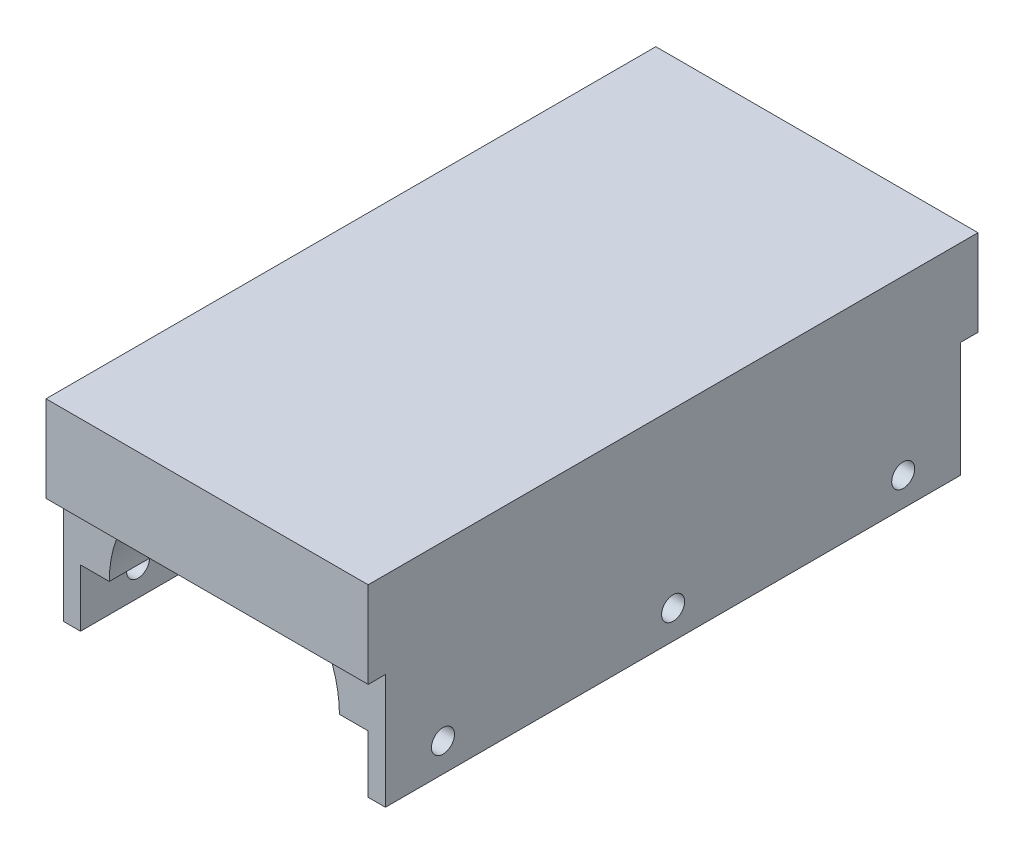
ISO-10303-21;
HEADER;
FILE_DESCRIPTION(('STEP AP214'),'2;1');
FILE_NAME('part.step','',(''),(''),'','','');
FILE_SCHEMA(('AUTOMOTIVE_DESIGN { 1 0 10303 214 1 1 1 1 }'));
ENDSEC;
DATA;
#1=APPLICATION_CONTEXT('core data for automotive mechanical design processes');
#2=APPLICATION_PROTOCOL_DEFINITION('international standard','automotive_design',2000,#1);
#3=PRODUCT_CONTEXT('',#1,'mechanical');
#4=PRODUCT('Part','Part','',(#3));
#5=PRODUCT_RELATED_PRODUCT_CATEGORY('part','',(#4));
#6=PRODUCT_DEFINITION_FORMATION('','',#4);
#7=PRODUCT_DEFINITION_CONTEXT('part definition',#1,'design');
#8=PRODUCT_DEFINITION('design','',#6,#7);
#9=PRODUCT_DEFINITION_SHAPE('','',#8);
#10=(LENGTH_UNIT() NAMED_UNIT(*) SI_UNIT(.MILLI.,.METRE.));
#11=(NAMED_UNIT(*) PLANE_ANGLE_UNIT() SI_UNIT($,.RADIAN.));
#12=(NAMED_UNIT(*) SI_UNIT($,.STERADIAN.) SOLID_ANGLE_UNIT());
#13=UNCERTAINTY_MEASURE_WITH_UNIT(LENGTH_MEASURE(1.E-05),#10,'distance_accuracy_value','');
#14=(GEOMETRIC_REPRESENTATION_CONTEXT(3) GLOBAL_UNCERTAINTY_ASSIGNED_CONTEXT((#13)) GLOBAL_UNIT_ASSIGNED_CONTEXT((#10,
#11,#12)) REPRESENTATION_CONTEXT('',''));
#15=CARTESIAN_POINT('',(0.,0.,0.));
#16=DIRECTION('',(0.,0.,1.));
#17=DIRECTION('',(1.,0.,0.));
#18=AXIS2_PLACEMENT_3D('',#15,#16,#17);
#19=CARTESIAN_POINT('',(0.,0.,-50.));
#20=DIRECTION('',(0.,0.,1.));
#21=DIRECTION('',(1.,0.,0.));
#22=AXIS2_PLACEMENT_3D('',#19,#20,#21);
#23=PLANE('',#22);
#24=DIRECTION('',(0.,-1.,0.));
#25=VECTOR('',#24,1.);
#26=CARTESIAN_POINT('',(-28.,25.,-50.));
#27=LINE('',#26,#25);
#28=CARTESIAN_POINT('',(-28.,9.99999999999999,-50.));
#29=VERTEX_POINT('',#28);
#30=CARTESIAN_POINT('',(-28.,-10.,-50.));
#31=VERTEX_POINT('',#30);
#32=EDGE_CURVE('E233',#29,#31,#27,.T.);
#33=ORIENTED_EDGE('',*,*,#32,.F.);
#34=DIRECTION('',(1.,0.,0.));
#35=VECTOR('',#34,1.);
#36=CARTESIAN_POINT('',(-28.,9.99999999999999,-50.));
#37=LINE('',#36,#35);
#38=CARTESIAN_POINT('',(-17.3205080756888,9.99999999999999,-50.));
#39=VERTEX_POINT('',#38);
#40=EDGE_CURVE('E50',#29,#39,#37,.T.);
#41=ORIENTED_EDGE('',*,*,#40,.T.);
#42=CARTESIAN_POINT('',(0.,0.,-50.));
#43=DIRECTION('',(0.,0.,-1.));
#44=DIRECTION('',(1.,0.,0.));
#45=AXIS2_PLACEMENT_3D('',#42,#43,#44);
#46=CIRCLE('',#45,20.);
#47=CARTESIAN_POINT('',(-20.,0.,-50.));
#48=VERTEX_POINT('',#47);
#49=EDGE_CURVE('E264',#48,#39,#46,.T.);
#50=ORIENTED_EDGE('',*,*,#49,.F.);
#51=DIRECTION('',(1.,0.,0.));
#52=VECTOR('',#51,1.);
#53=CARTESIAN_POINT('',(-25.,0.,-50.));
#54=LINE('',#53,#52);
#55=CARTESIAN_POINT('',(-25.,0.,-50.));
#56=VERTEX_POINT('',#55);
#57=EDGE_CURVE('E261',#56,#48,#54,.T.);
#58=ORIENTED_EDGE('',*,*,#57,.F.);
#59=DIRECTION('',(0.,1.,0.));
#60=VECTOR('',#59,1.);
#61=CARTESIAN_POINT('',(-25.,-10.,-50.));
#62=LINE('',#61,#60);
#63=CARTESIAN_POINT('',(-25.,-10.,-50.));
#64=VERTEX_POINT('',#63);
#65=EDGE_CURVE('E259',#64,#56,#62,.T.);
#66=ORIENTED_EDGE('',*,*,#65,.F.);
#67=DIRECTION('',(1.,0.,0.));
#68=VECTOR('',#67,1.);
#69=CARTESIAN_POINT('',(-28.,-10.,-50.));
#70=LINE('',#69,#68);
#71=EDGE_CURVE('E257',#31,#64,#70,.T.);
#72=ORIENTED_EDGE('',*,*,#71,.F.);
#73=EDGE_LOOP('',(#33,#41,#50,#58,#66,#72));
#74=FACE_BOUND('',#73,.T.);
#75=ADVANCED_FACE('F39',(#74),#23,.F.);
#76=CARTESIAN_POINT('',(0.,0.,50.));
#77=DIRECTION('',(0.,0.,1.));
#78=DIRECTION('',(1.,0.,0.));
#79=AXIS2_PLACEMENT_3D('',#76,#77,#78);
#80=PLANE('',#79);
#81=DIRECTION('',(1.,0.,0.));
#82=VECTOR('',#81,1.);
#83=CARTESIAN_POINT('',(-28.,9.99999999999999,50.));
#84=LINE('',#83,#82);
#85=CARTESIAN_POINT('',(-28.,9.99999999999999,50.));
#86=VERTEX_POINT('',#85);
#87=CARTESIAN_POINT('',(-17.3205080756888,9.99999999999999,50.));
#88=VERTEX_POINT('',#87);
#89=EDGE_CURVE('E189',#86,#88,#84,.T.);
#90=ORIENTED_EDGE('',*,*,#89,.F.);
#91=DIRECTION('',(0.,-1.,0.));
#92=VECTOR('',#91,1.);
#93=CARTESIAN_POINT('',(-28.,25.,50.));
#94=LINE('',#93,#92);
#95=CARTESIAN_POINT('',(-28.,-10.,50.));
#96=VERTEX_POINT('',#95);
#97=EDGE_CURVE('E234',#86,#96,#94,.T.);
#98=ORIENTED_EDGE('',*,*,#97,.T.);
#99=DIRECTION('',(1.,0.,0.));
#100=VECTOR('',#99,1.);
#101=CARTESIAN_POINT('',(-28.,-10.,50.));
#102=LINE('',#101,#100);
#103=CARTESIAN_POINT('',(-25.,-10.,50.));
#104=VERTEX_POINT('',#103);
#105=EDGE_CURVE('E236',#96,#104,#102,.T.);
#106=ORIENTED_EDGE('',*,*,#105,.T.);
#107=DIRECTION('',(0.,1.,0.));
#108=VECTOR('',#107,1.);
#109=CARTESIAN_POINT('',(-25.,-10.,50.));
#110=LINE('',#109,#108);
#111=CARTESIAN_POINT('',(-25.,0.,50.));
#112=VERTEX_POINT('',#111);
#113=EDGE_CURVE('E239',#104,#112,#110,.T.);
#114=ORIENTED_EDGE('',*,*,#113,.T.);
#115=DIRECTION('',(1.,0.,0.));
#116=VECTOR('',#115,1.);
#117=CARTESIAN_POINT('',(-25.,0.,50.));
#118=LINE('',#117,#116);
#119=CARTESIAN_POINT('',(-20.,0.,50.));
#120=VERTEX_POINT('',#119);
#121=EDGE_CURVE('E241',#112,#120,#118,.T.);
#122=ORIENTED_EDGE('',*,*,#121,.T.);
#123=CARTESIAN_POINT('',(0.,0.,50.));
#124=DIRECTION('',(0.,0.,-1.));
#125=DIRECTION('',(1.,0.,0.));
#126=AXIS2_PLACEMENT_3D('',#123,#124,#125);
#127=CIRCLE('',#126,20.);
#128=EDGE_CURVE('E244',#120,#88,#127,.T.);
#129=ORIENTED_EDGE('',*,*,#128,.T.);
#130=EDGE_LOOP('',(#90,#98,#106,#114,#122,#129));
#131=FACE_BOUND('',#130,.T.);
#132=ADVANCED_FACE('F377',(#131),#80,.T.);
#133=CARTESIAN_POINT('',(-28.,25.,50.));
#134=DIRECTION('',(0.,-1.,0.));
#135=DIRECTION('',(0.,0.,-1.));
#136=AXIS2_PLACEMENT_3D('',#133,#134,#135);
#137=PLANE('',#136);
#138=DIRECTION('',(0.,0.,-1.));
#139=VECTOR('',#138,1.);
#140=CARTESIAN_POINT('',(28.,25.,50.));
#141=LINE('',#140,#139);
#142=CARTESIAN_POINT('',(28.,25.,53.));
#143=VERTEX_POINT('',#142);
#144=CARTESIAN_POINT('',(28.,25.,-53.));
#145=VERTEX_POINT('',#144);
#146=EDGE_CURVE('E176',#143,#145,#141,.T.);
#147=ORIENTED_EDGE('',*,*,#146,.T.);
#148=DIRECTION('',(-1.,0.,0.));
#149=VECTOR('',#148,1.);
#150=CARTESIAN_POINT('',(-28.,25.,-53.));
#151=LINE('',#150,#149);
#152=CARTESIAN_POINT('',(-28.,25.,-53.));
#153=VERTEX_POINT('',#152);
#154=EDGE_CURVE('E172',#145,#153,#151,.T.);
#155=ORIENTED_EDGE('',*,*,#154,.T.);
#156=DIRECTION('',(0.,0.,-1.));
#157=VECTOR('',#156,1.);
#158=CARTESIAN_POINT('',(-28.,25.,50.));
#159=LINE('',#158,#157);
#160=CARTESIAN_POINT('',(-28.,25.,53.));
#161=VERTEX_POINT('',#160);
#162=EDGE_CURVE('E154',#161,#153,#159,.T.);
#163=ORIENTED_EDGE('',*,*,#162,.F.);
#164=DIRECTION('',(-1.,0.,0.));
#165=VECTOR('',#164,1.);
#166=CARTESIAN_POINT('',(-28.,25.,53.));
#167=LINE('',#166,#165);
#168=EDGE_CURVE('E194',#143,#161,#167,.T.);
#169=ORIENTED_EDGE('',*,*,#168,.F.);
#170=EDGE_LOOP('',(#147,#155,#163,#169));
#171=FACE_BOUND('',#170,.T.);
#172=ADVANCED_FACE('F41',(#171),#137,.F.);
#173=CARTESIAN_POINT('',(-28.,25.,50.));
#174=DIRECTION('',(1.,0.,0.));
#175=DIRECTION('',(0.,1.,0.));
#176=AXIS2_PLACEMENT_3D('',#173,#174,#175);
#177=PLANE('',#176);
#178=CARTESIAN_POINT('',(-28.,-5.,40.));
#179=DIRECTION('',(1.,0.,0.));
#180=DIRECTION('',(0.,1.,0.));
#181=AXIS2_PLACEMENT_3D('',#178,#179,#180);
#182=CIRCLE('',#181,2.);
#183=CARTESIAN_POINT('',(-28.,-3.,40.));
#184=VERTEX_POINT('',#183);
#185=EDGE_CURVE('E230',#184,#184,#182,.T.);
#186=ORIENTED_EDGE('',*,*,#185,.T.);
#187=EDGE_LOOP('',(#186));
#188=FACE_BOUND('',#187,.T.);
#189=CARTESIAN_POINT('',(-28.,-5.,0.));
#190=DIRECTION('',(1.,0.,0.));
#191=DIRECTION('',(0.,1.,0.));
#192=AXIS2_PLACEMENT_3D('',#189,#190,#191);
#193=CIRCLE('',#192,2.);
#194=CARTESIAN_POINT('',(-28.,-3.,0.));
#195=VERTEX_POINT('',#194);
#196=EDGE_CURVE('E221',#195,#195,#193,.T.);
#197=ORIENTED_EDGE('',*,*,#196,.T.);
#198=EDGE_LOOP('',(#197));
#199=FACE_BOUND('',#198,.T.);
#200=CARTESIAN_POINT('',(-28.,-5.,-40.));
#201=DIRECTION('',(1.,0.,0.));
#202=DIRECTION('',(0.,1.,0.));
#203=AXIS2_PLACEMENT_3D('',#200,#201,#202);
#204=CIRCLE('',#203,2.);
#205=CARTESIAN_POINT('',(-28.,-3.,-40.));
#206=VERTEX_POINT('',#205);
#207=EDGE_CURVE('E211',#206,#206,#204,.T.);
#208=ORIENTED_EDGE('',*,*,#207,.T.);
#209=EDGE_LOOP('',(#208));
#210=FACE_BOUND('',#209,.T.);
#211=ORIENTED_EDGE('',*,*,#162,.T.);
#212=DIRECTION('',(0.,-1.,0.));
#213=VECTOR('',#212,1.);
#214=CARTESIAN_POINT('',(-28.,25.,-53.));
#215=LINE('',#214,#213);
#216=CARTESIAN_POINT('',(-28.,9.99999999999999,-53.));
#217=VERTEX_POINT('',#216);
#218=EDGE_CURVE('E157',#153,#217,#215,.T.);
#219=ORIENTED_EDGE('',*,*,#218,.T.);
#220=DIRECTION('',(0.,0.,1.));
#221=VECTOR('',#220,1.);
#222=CARTESIAN_POINT('',(-28.,9.99999999999999,-53.));
#223=LINE('',#222,#221);
#224=EDGE_CURVE('E181',#217,#29,#223,.T.);
#225=ORIENTED_EDGE('',*,*,#224,.T.);
#226=ORIENTED_EDGE('',*,*,#32,.T.);
#227=DIRECTION('',(0.,0.,-1.));
#228=VECTOR('',#227,1.);
#229=CARTESIAN_POINT('',(-28.,-10.,50.));
#230=LINE('',#229,#228);
#231=EDGE_CURVE('E166',#96,#31,#230,.T.);
#232=ORIENTED_EDGE('',*,*,#231,.F.);
#233=ORIENTED_EDGE('',*,*,#97,.F.);
#234=DIRECTION('',(0.,0.,-1.));
#235=VECTOR('',#234,1.);
#236=CARTESIAN_POINT('',(-28.,9.99999999999999,53.));
#237=LINE('',#236,#235);
#238=CARTESIAN_POINT('',(-28.,9.99999999999999,53.));
#239=VERTEX_POINT('',#238);
#240=EDGE_CURVE('E201',#239,#86,#237,.T.);
#241=ORIENTED_EDGE('',*,*,#240,.F.);
#242=DIRECTION('',(0.,-1.,0.));
#243=VECTOR('',#242,1.);
#244=CARTESIAN_POINT('',(-28.,25.,53.));
#245=LINE('',#244,#243);
#246=EDGE_CURVE('E161',#161,#239,#245,.T.);
#247=ORIENTED_EDGE('',*,*,#246,.F.);
#248=EDGE_LOOP('',(#211,#219,#225,#226,#232,#233,#241,#247));
#249=FACE_BOUND('',#248,.T.);
#250=ADVANCED_FACE('F156',(#188,#199,#210,#249),#177,.F.);
#251=CARTESIAN_POINT('',(-28.,-10.,50.));
#252=DIRECTION('',(0.,1.,0.));
#253=DIRECTION('',(0.,0.,1.));
#254=AXIS2_PLACEMENT_3D('',#251,#252,#253);
#255=PLANE('',#254);
#256=ORIENTED_EDGE('',*,*,#71,.T.);
#257=DIRECTION('',(0.,0.,-1.));
#258=VECTOR('',#257,1.);
#259=CARTESIAN_POINT('',(-25.,-10.,50.));
#260=LINE('',#259,#258);
#261=EDGE_CURVE('E295',#104,#64,#260,.T.);
#262=ORIENTED_EDGE('',*,*,#261,.F.);
#263=ORIENTED_EDGE('',*,*,#105,.F.);
#264=ORIENTED_EDGE('',*,*,#231,.T.);
#265=EDGE_LOOP('',(#256,#262,#263,#264));
#266=FACE_BOUND('',#265,.T.);
#267=ADVANCED_FACE('F373',(#266),#255,.F.);
#268=CARTESIAN_POINT('',(-25.,-10.,50.));
#269=DIRECTION('',(-1.,0.,0.));
#270=DIRECTION('',(0.,0.,1.));
#271=AXIS2_PLACEMENT_3D('',#268,#269,#270);
#272=PLANE('',#271);
#273=CARTESIAN_POINT('',(-25.,-5.,40.));
#274=DIRECTION('',(-1.,0.,0.));
#275=DIRECTION('',(0.,0.,1.));
#276=AXIS2_PLACEMENT_3D('',#273,#274,#275);
#277=CIRCLE('',#276,2.);
#278=CARTESIAN_POINT('',(-25.,-5.,42.));
#279=VERTEX_POINT('',#278);
#280=EDGE_CURVE('E227',#279,#279,#277,.T.);
#281=ORIENTED_EDGE('',*,*,#280,.T.);
#282=EDGE_LOOP('',(#281));
#283=FACE_BOUND('',#282,.T.);
#284=CARTESIAN_POINT('',(-25.,-5.,0.));
#285=DIRECTION('',(-1.,0.,0.));
#286=DIRECTION('',(0.,0.,1.));
#287=AXIS2_PLACEMENT_3D('',#284,#285,#286);
#288=CIRCLE('',#287,2.);
#289=CARTESIAN_POINT('',(-25.,-5.,2.));
#290=VERTEX_POINT('',#289);
#291=EDGE_CURVE('E218',#290,#290,#288,.T.);
#292=ORIENTED_EDGE('',*,*,#291,.T.);
#293=EDGE_LOOP('',(#292));
#294=FACE_BOUND('',#293,.T.);
#295=CARTESIAN_POINT('',(-25.,-5.,-40.));
#296=DIRECTION('',(-1.,0.,0.));
#297=DIRECTION('',(0.,0.,1.));
#298=AXIS2_PLACEMENT_3D('',#295,#296,#297);
#299=CIRCLE('',#298,2.);
#300=CARTESIAN_POINT('',(-25.,-5.,-38.));
#301=VERTEX_POINT('',#300);
#302=EDGE_CURVE('E208',#301,#301,#299,.T.);
#303=ORIENTED_EDGE('',*,*,#302,.T.);
#304=EDGE_LOOP('',(#303));
#305=FACE_BOUND('',#304,.T.);
#306=ORIENTED_EDGE('',*,*,#65,.T.);
#307=DIRECTION('',(0.,0.,-1.));
#308=VECTOR('',#307,1.);
#309=CARTESIAN_POINT('',(-25.,0.,50.));
#310=LINE('',#309,#308);
#311=EDGE_CURVE('E292',#112,#56,#310,.T.);
#312=ORIENTED_EDGE('',*,*,#311,.F.);
#313=ORIENTED_EDGE('',*,*,#113,.F.);
#314=ORIENTED_EDGE('',*,*,#261,.T.);
#315=EDGE_LOOP('',(#306,#312,#313,#314));
#316=FACE_BOUND('',#315,.T.);
#317=ADVANCED_FACE('F585',(#283,#294,#305,#316),#272,.F.);
#318=CARTESIAN_POINT('',(-25.,0.,50.));
#319=DIRECTION('',(0.,1.,0.));
#320=DIRECTION('',(-1.,0.,0.));
#321=AXIS2_PLACEMENT_3D('',#318,#319,#320);
#322=PLANE('',#321);
#323=ORIENTED_EDGE('',*,*,#57,.T.);
#324=DIRECTION('',(0.,0.,-1.));
#325=VECTOR('',#324,1.);
#326=CARTESIAN_POINT('',(-20.,0.,50.));
#327=LINE('',#326,#325);
#328=EDGE_CURVE('E289',#120,#48,#327,.T.);
#329=ORIENTED_EDGE('',*,*,#328,.F.);
#330=ORIENTED_EDGE('',*,*,#121,.F.);
#331=ORIENTED_EDGE('',*,*,#311,.T.);
#332=EDGE_LOOP('',(#323,#329,#330,#331));
#333=FACE_BOUND('',#332,.T.);
#334=ADVANCED_FACE('F490',(#333),#322,.F.);
#335=CARTESIAN_POINT('',(0.,0.,50.));
#336=DIRECTION('',(0.,0.,-1.));
#337=DIRECTION('',(-1.,0.,0.));
#338=AXIS2_PLACEMENT_3D('',#335,#336,#337);
#339=CYLINDRICAL_SURFACE('',#338,20.);
#340=ORIENTED_EDGE('',*,*,#49,.T.);
#341=CARTESIAN_POINT('',(17.3205080756888,10.,-50.));
#342=VERTEX_POINT('',#341);
#343=EDGE_CURVE('E268',#39,#342,#46,.T.);
#344=ORIENTED_EDGE('',*,*,#343,.T.);
#345=CARTESIAN_POINT('',(20.,0.,-50.));
#346=VERTEX_POINT('',#345);
#347=EDGE_CURVE('E263',#342,#346,#46,.T.);
#348=ORIENTED_EDGE('',*,*,#347,.T.);
#349=DIRECTION('',(0.,0.,-1.));
#350=VECTOR('',#349,1.);
#351=CARTESIAN_POINT('',(20.,0.,50.));
#352=LINE('',#351,#350);
#353=CARTESIAN_POINT('',(20.,0.,50.));
#354=VERTEX_POINT('',#353);
#355=EDGE_CURVE('E286',#354,#346,#352,.T.);
#356=ORIENTED_EDGE('',*,*,#355,.F.);
#357=CARTESIAN_POINT('',(17.3205080756888,9.99999999999999,50.));
#358=VERTEX_POINT('',#357);
#359=EDGE_CURVE('E243',#358,#354,#127,.T.);
#360=ORIENTED_EDGE('',*,*,#359,.F.);
#361=EDGE_CURVE('E248',#88,#358,#127,.T.);
#362=ORIENTED_EDGE('',*,*,#361,.F.);
#363=ORIENTED_EDGE('',*,*,#128,.F.);
#364=ORIENTED_EDGE('',*,*,#328,.T.);
#365=EDGE_LOOP('',(#340,#344,#348,#356,#360,#362,#363,#364));
#366=FACE_BOUND('',#365,.T.);
#367=ADVANCED_FACE('F354',(#366),#339,.F.);
#368=CARTESIAN_POINT('',(20.,0.,50.));
#369=DIRECTION('',(0.,1.,0.));
#370=DIRECTION('',(-1.,0.,0.));
#371=AXIS2_PLACEMENT_3D('',#368,#369,#370);
#372=PLANE('',#371);
#373=DIRECTION('',(1.,0.,0.));
#374=VECTOR('',#373,1.);
#375=CARTESIAN_POINT('',(20.,0.,-50.));
#376=LINE('',#375,#374);
#377=CARTESIAN_POINT('',(25.,0.,-50.));
#378=VERTEX_POINT('',#377);
#379=EDGE_CURVE('E267',#346,#378,#376,.T.);
#380=ORIENTED_EDGE('',*,*,#379,.T.);
#381=DIRECTION('',(0.,0.,-1.));
#382=VECTOR('',#381,1.);
#383=CARTESIAN_POINT('',(25.,0.,50.));
#384=LINE('',#383,#382);
#385=CARTESIAN_POINT('',(25.,0.,50.));
#386=VERTEX_POINT('',#385);
#387=EDGE_CURVE('E283',#386,#378,#384,.T.);
#388=ORIENTED_EDGE('',*,*,#387,.F.);
#389=DIRECTION('',(1.,0.,0.));
#390=VECTOR('',#389,1.);
#391=CARTESIAN_POINT('',(20.,0.,50.));
#392=LINE('',#391,#390);
#393=EDGE_CURVE('E247',#354,#386,#392,.T.);
#394=ORIENTED_EDGE('',*,*,#393,.F.);
#395=ORIENTED_EDGE('',*,*,#355,.T.);
#396=EDGE_LOOP('',(#380,#388,#394,#395));
#397=FACE_BOUND('',#396,.T.);
#398=ADVANCED_FACE('F320',(#397),#372,.F.);
#399=CARTESIAN_POINT('',(25.,0.,50.));
#400=DIRECTION('',(1.,0.,0.));
#401=DIRECTION('',(0.,0.,-1.));
#402=AXIS2_PLACEMENT_3D('',#399,#400,#401);
#403=PLANE('',#402);
#404=CARTESIAN_POINT('',(25.,-5.,40.));
#405=DIRECTION('',(1.,0.,0.));
#406=DIRECTION('',(0.,0.,-1.));
#407=AXIS2_PLACEMENT_3D('',#404,#405,#406);
#408=CIRCLE('',#407,2.);
#409=CARTESIAN_POINT('',(25.,-5.,38.));
#410=VERTEX_POINT('',#409);
#411=EDGE_CURVE('E224',#410,#410,#408,.T.);
#412=ORIENTED_EDGE('',*,*,#411,.T.);
#413=EDGE_LOOP('',(#412));
#414=FACE_BOUND('',#413,.T.);
#415=CARTESIAN_POINT('',(25.,-5.,0.));
#416=DIRECTION('',(1.,0.,0.));
#417=DIRECTION('',(0.,0.,-1.));
#418=AXIS2_PLACEMENT_3D('',#415,#416,#417);
#419=CIRCLE('',#418,2.);
#420=CARTESIAN_POINT('',(25.,-5.,-2.));
#421=VERTEX_POINT('',#420);
#422=EDGE_CURVE('E215',#421,#421,#419,.T.);
#423=ORIENTED_EDGE('',*,*,#422,.T.);
#424=EDGE_LOOP('',(#423));
#425=FACE_BOUND('',#424,.T.);
#426=CARTESIAN_POINT('',(25.,-5.,-40.));
#427=DIRECTION('',(1.,0.,0.));
#428=DIRECTION('',(0.,0.,-1.));
#429=AXIS2_PLACEMENT_3D('',#426,#427,#428);
#430=CIRCLE('',#429,2.);
#431=CARTESIAN_POINT('',(25.,-5.,-42.));
#432=VERTEX_POINT('',#431);
#433=EDGE_CURVE('E205',#432,#432,#430,.T.);
#434=ORIENTED_EDGE('',*,*,#433,.T.);
#435=EDGE_LOOP('',(#434));
#436=FACE_BOUND('',#435,.T.);
#437=DIRECTION('',(0.,-1.,0.));
#438=VECTOR('',#437,1.);
#439=CARTESIAN_POINT('',(25.,0.,-50.));
#440=LINE('',#439,#438);
#441=CARTESIAN_POINT('',(25.,-10.,-50.));
#442=VERTEX_POINT('',#441);
#443=EDGE_CURVE('E270',#378,#442,#440,.T.);
#444=ORIENTED_EDGE('',*,*,#443,.T.);
#445=DIRECTION('',(0.,0.,-1.));
#446=VECTOR('',#445,1.);
#447=CARTESIAN_POINT('',(25.,-10.,50.));
#448=LINE('',#447,#446);
#449=CARTESIAN_POINT('',(25.,-10.,50.));
#450=VERTEX_POINT('',#449);
#451=EDGE_CURVE('E280',#450,#442,#448,.T.);
#452=ORIENTED_EDGE('',*,*,#451,.F.);
#453=DIRECTION('',(0.,-1.,0.));
#454=VECTOR('',#453,1.);
#455=CARTESIAN_POINT('',(25.,0.,50.));
#456=LINE('',#455,#454);
#457=EDGE_CURVE('E250',#386,#450,#456,.T.);
#458=ORIENTED_EDGE('',*,*,#457,.F.);
#459=ORIENTED_EDGE('',*,*,#387,.T.);
#460=EDGE_LOOP('',(#444,#452,#458,#459));
#461=FACE_BOUND('',#460,.T.);
#462=ADVANCED_FACE('F316',(#414,#425,#436,#461),#403,.F.);
#463=CARTESIAN_POINT('',(25.,-10.,50.));
#464=DIRECTION('',(0.,1.,0.));
#465=DIRECTION('',(0.,0.,1.));
#466=AXIS2_PLACEMENT_3D('',#463,#464,#465);
#467=PLANE('',#466);
#468=DIRECTION('',(1.,0.,0.));
#469=VECTOR('',#468,1.);
#470=CARTESIAN_POINT('',(25.,-10.,-50.));
#471=LINE('',#470,#469);
#472=CARTESIAN_POINT('',(28.,-10.,-50.));
#473=VERTEX_POINT('',#472);
#474=EDGE_CURVE('E272',#442,#473,#471,.T.);
#475=ORIENTED_EDGE('',*,*,#474,.T.);
#476=DIRECTION('',(0.,0.,-1.));
#477=VECTOR('',#476,1.);
#478=CARTESIAN_POINT('',(28.,-10.,50.));
#479=LINE('',#478,#477);
#480=CARTESIAN_POINT('',(28.,-10.,50.));
#481=VERTEX_POINT('',#480);
#482=EDGE_CURVE('E277',#481,#473,#479,.T.);
#483=ORIENTED_EDGE('',*,*,#482,.F.);
#484=DIRECTION('',(1.,0.,0.));
#485=VECTOR('',#484,1.);
#486=CARTESIAN_POINT('',(25.,-10.,50.));
#487=LINE('',#486,#485);
#488=EDGE_CURVE('E252',#450,#481,#487,.T.);
#489=ORIENTED_EDGE('',*,*,#488,.F.);
#490=ORIENTED_EDGE('',*,*,#451,.T.);
#491=EDGE_LOOP('',(#475,#483,#489,#490));
#492=FACE_BOUND('',#491,.T.);
#493=ADVANCED_FACE('F319',(#492),#467,.F.);
#494=CARTESIAN_POINT('',(28.,-10.,50.));
#495=DIRECTION('',(-1.,0.,0.));
#496=DIRECTION('',(0.,-1.,0.));
#497=AXIS2_PLACEMENT_3D('',#494,#495,#496);
#498=PLANE('',#497);
#499=CARTESIAN_POINT('',(28.,-5.,40.));
#500=DIRECTION('',(-1.,0.,0.));
#501=DIRECTION('',(0.,-1.,0.));
#502=AXIS2_PLACEMENT_3D('',#499,#500,#501);
#503=CIRCLE('',#502,2.);
#504=CARTESIAN_POINT('',(28.,-6.99999999999999,40.));
#505=VERTEX_POINT('',#504);
#506=EDGE_CURVE('E43',#505,#505,#503,.T.);
#507=ORIENTED_EDGE('',*,*,#506,.T.);
#508=EDGE_LOOP('',(#507));
#509=FACE_BOUND('',#508,.T.);
#510=CARTESIAN_POINT('',(28.,-5.,0.));
#511=DIRECTION('',(-1.,0.,0.));
#512=DIRECTION('',(0.,-1.,0.));
#513=AXIS2_PLACEMENT_3D('',#510,#511,#512);
#514=CIRCLE('',#513,2.);
#515=CARTESIAN_POINT('',(28.,-7.,0.));
#516=VERTEX_POINT('',#515);
#517=EDGE_CURVE('E214',#516,#516,#514,.T.);
#518=ORIENTED_EDGE('',*,*,#517,.T.);
#519=EDGE_LOOP('',(#518));
#520=FACE_BOUND('',#519,.T.);
#521=CARTESIAN_POINT('',(28.,-5.,-40.));
#522=DIRECTION('',(-1.,0.,0.));
#523=DIRECTION('',(0.,-1.,0.));
#524=AXIS2_PLACEMENT_3D('',#521,#522,#523);
#525=CIRCLE('',#524,2.);
#526=CARTESIAN_POINT('',(28.,-7.,-40.));
#527=VERTEX_POINT('',#526);
#528=EDGE_CURVE('E204',#527,#527,#525,.T.);
#529=ORIENTED_EDGE('',*,*,#528,.T.);
#530=EDGE_LOOP('',(#529));
#531=FACE_BOUND('',#530,.T.);
#532=DIRECTION('',(0.,1.,0.));
#533=VECTOR('',#532,1.);
#534=CARTESIAN_POINT('',(28.,-10.,-50.));
#535=LINE('',#534,#533);
#536=CARTESIAN_POINT('',(28.,10.,-50.));
#537=VERTEX_POINT('',#536);
#538=EDGE_CURVE('E237',#473,#537,#535,.T.);
#539=ORIENTED_EDGE('',*,*,#538,.T.);
#540=DIRECTION('',(0.,0.,1.));
#541=VECTOR('',#540,1.);
#542=CARTESIAN_POINT('',(28.,10.,-53.));
#543=LINE('',#542,#541);
#544=CARTESIAN_POINT('',(28.,10.,-53.));
#545=VERTEX_POINT('',#544);
#546=EDGE_CURVE('E58',#545,#537,#543,.T.);
#547=ORIENTED_EDGE('',*,*,#546,.F.);
#548=DIRECTION('',(0.,1.,0.));
#549=VECTOR('',#548,1.);
#550=CARTESIAN_POINT('',(28.,25.,-53.));
#551=LINE('',#550,#549);
#552=EDGE_CURVE('E177',#545,#145,#551,.T.);
#553=ORIENTED_EDGE('',*,*,#552,.T.);
#554=ORIENTED_EDGE('',*,*,#146,.F.);
#555=DIRECTION('',(0.,1.,0.));
#556=VECTOR('',#555,1.);
#557=CARTESIAN_POINT('',(28.,25.,53.));
#558=LINE('',#557,#556);
#559=CARTESIAN_POINT('',(28.,10.,53.));
#560=VERTEX_POINT('',#559);
#561=EDGE_CURVE('E191',#560,#143,#558,.T.);
#562=ORIENTED_EDGE('',*,*,#561,.F.);
#563=DIRECTION('',(0.,0.,-1.));
#564=VECTOR('',#563,1.);
#565=CARTESIAN_POINT('',(28.,10.,53.));
#566=LINE('',#565,#564);
#567=CARTESIAN_POINT('',(28.,10.,50.));
#568=VERTEX_POINT('',#567);
#569=EDGE_CURVE('E196',#560,#568,#566,.T.);
#570=ORIENTED_EDGE('',*,*,#569,.T.);
#571=DIRECTION('',(0.,1.,0.));
#572=VECTOR('',#571,1.);
#573=CARTESIAN_POINT('',(28.,-10.,50.));
#574=LINE('',#573,#572);
#575=EDGE_CURVE('E254',#481,#568,#574,.T.);
#576=ORIENTED_EDGE('',*,*,#575,.F.);
#577=ORIENTED_EDGE('',*,*,#482,.T.);
#578=EDGE_LOOP('',(#539,#547,#553,#554,#562,#570,#576,#577));
#579=FACE_BOUND('',#578,.T.);
#580=ADVANCED_FACE('F304',(#509,#520,#531,#579),#498,.F.);
#581=EDGE_CURVE('E48',#358,#568,#84,.T.);
#582=ORIENTED_EDGE('',*,*,#581,.F.);
#583=ORIENTED_EDGE('',*,*,#359,.T.);
#584=ORIENTED_EDGE('',*,*,#393,.T.);
#585=ORIENTED_EDGE('',*,*,#457,.T.);
#586=ORIENTED_EDGE('',*,*,#488,.T.);
#587=ORIENTED_EDGE('',*,*,#575,.T.);
#588=EDGE_LOOP('',(#582,#583,#584,#585,#586,#587));
#589=FACE_BOUND('',#588,.T.);
#590=ADVANCED_FACE('F342',(#589),#80,.T.);
#591=ORIENTED_EDGE('',*,*,#347,.F.);
#592=EDGE_CURVE('E11',#342,#537,#37,.T.);
#593=ORIENTED_EDGE('',*,*,#592,.T.);
#594=ORIENTED_EDGE('',*,*,#538,.F.);
#595=ORIENTED_EDGE('',*,*,#474,.F.);
#596=ORIENTED_EDGE('',*,*,#443,.F.);
#597=ORIENTED_EDGE('',*,*,#379,.F.);
#598=EDGE_LOOP('',(#591,#593,#594,#595,#596,#597));
#599=FACE_BOUND('',#598,.T.);
#600=ADVANCED_FACE('F337',(#599),#23,.F.);
#601=CARTESIAN_POINT('',(-125.,-5.,-40.));
#602=DIRECTION('',(1.,0.,0.));
#603=DIRECTION('',(0.,0.,-1.));
#604=AXIS2_PLACEMENT_3D('',#601,#602,#603);
#605=CYLINDRICAL_SURFACE('',#604,2.);
#606=ORIENTED_EDGE('',*,*,#528,.F.);
#607=EDGE_LOOP('',(#606));
#608=FACE_BOUND('',#607,.T.);
#609=ORIENTED_EDGE('',*,*,#433,.F.);
#610=EDGE_LOOP('',(#609));
#611=FACE_BOUND('',#610,.T.);
#612=ADVANCED_FACE('F311',(#608,#611),#605,.F.);
#613=CARTESIAN_POINT('',(-125.,-5.,0.));
#614=DIRECTION('',(1.,0.,0.));
#615=DIRECTION('',(0.,0.,-1.));
#616=AXIS2_PLACEMENT_3D('',#613,#614,#615);
#617=CYLINDRICAL_SURFACE('',#616,2.);
#618=ORIENTED_EDGE('',*,*,#517,.F.);
#619=EDGE_LOOP('',(#618));
#620=FACE_BOUND('',#619,.T.);
#621=ORIENTED_EDGE('',*,*,#422,.F.);
#622=EDGE_LOOP('',(#621));
#623=FACE_BOUND('',#622,.T.);
#624=ADVANCED_FACE('F307',(#620,#623),#617,.F.);
#625=CARTESIAN_POINT('',(-125.,-5.,40.));
#626=DIRECTION('',(1.,0.,0.));
#627=DIRECTION('',(0.,0.,-1.));
#628=AXIS2_PLACEMENT_3D('',#625,#626,#627);
#629=CYLINDRICAL_SURFACE('',#628,2.);
#630=ORIENTED_EDGE('',*,*,#506,.F.);
#631=EDGE_LOOP('',(#630));
#632=FACE_BOUND('',#631,.T.);
#633=ORIENTED_EDGE('',*,*,#411,.F.);
#634=EDGE_LOOP('',(#633));
#635=FACE_BOUND('',#634,.T.);
#636=ADVANCED_FACE('F310',(#632,#635),#629,.F.);
#637=ORIENTED_EDGE('',*,*,#302,.F.);
#638=EDGE_LOOP('',(#637));
#639=FACE_BOUND('',#638,.T.);
#640=ORIENTED_EDGE('',*,*,#207,.F.);
#641=EDGE_LOOP('',(#640));
#642=FACE_BOUND('',#641,.T.);
#643=ADVANCED_FACE('F405',(#639,#642),#605,.F.);
#644=ORIENTED_EDGE('',*,*,#291,.F.);
#645=EDGE_LOOP('',(#644));
#646=FACE_BOUND('',#645,.T.);
#647=ORIENTED_EDGE('',*,*,#196,.F.);
#648=EDGE_LOOP('',(#647));
#649=FACE_BOUND('',#648,.T.);
#650=ADVANCED_FACE('F313',(#646,#649),#617,.F.);
#651=ORIENTED_EDGE('',*,*,#280,.F.);
#652=EDGE_LOOP('',(#651));
#653=FACE_BOUND('',#652,.T.);
#654=ORIENTED_EDGE('',*,*,#185,.F.);
#655=EDGE_LOOP('',(#654));
#656=FACE_BOUND('',#655,.T.);
#657=ADVANCED_FACE('F415',(#653,#656),#629,.F.);
#658=CARTESIAN_POINT('',(0.,0.,50.));
#659=DIRECTION('',(0.,0.,1.));
#660=DIRECTION('',(1.,0.,0.));
#661=AXIS2_PLACEMENT_3D('',#658,#659,#660);
#662=PLANE('',#661);
#663=EDGE_CURVE('E186',#88,#358,#84,.T.);
#664=ORIENTED_EDGE('',*,*,#663,.F.);
#665=ORIENTED_EDGE('',*,*,#361,.T.);
#666=EDGE_LOOP('',(#664,#665));
#667=FACE_BOUND('',#666,.T.);
#668=ADVANCED_FACE('F349',(#667),#662,.F.);
#669=CARTESIAN_POINT('',(-28.,9.99999999999999,53.));
#670=DIRECTION('',(0.,1.,0.));
#671=DIRECTION('',(-1.,0.,0.));
#672=AXIS2_PLACEMENT_3D('',#669,#670,#671);
#673=PLANE('',#672);
#674=ORIENTED_EDGE('',*,*,#89,.T.);
#675=ORIENTED_EDGE('',*,*,#663,.T.);
#676=ORIENTED_EDGE('',*,*,#581,.T.);
#677=ORIENTED_EDGE('',*,*,#569,.F.);
#678=DIRECTION('',(1.,0.,0.));
#679=VECTOR('',#678,1.);
#680=CARTESIAN_POINT('',(-28.,9.99999999999999,53.));
#681=LINE('',#680,#679);
#682=EDGE_CURVE('E188',#239,#560,#681,.T.);
#683=ORIENTED_EDGE('',*,*,#682,.F.);
#684=ORIENTED_EDGE('',*,*,#240,.T.);
#685=EDGE_LOOP('',(#674,#675,#676,#677,#683,#684));
#686=FACE_BOUND('',#685,.T.);
#687=ADVANCED_FACE('F345',(#686),#673,.F.);
#688=CARTESIAN_POINT('',(0.,0.,53.));
#689=DIRECTION('',(0.,0.,1.));
#690=DIRECTION('',(1.,0.,0.));
#691=AXIS2_PLACEMENT_3D('',#688,#689,#690);
#692=PLANE('',#691);
#693=ORIENTED_EDGE('',*,*,#246,.T.);
#694=ORIENTED_EDGE('',*,*,#682,.T.);
#695=ORIENTED_EDGE('',*,*,#561,.T.);
#696=ORIENTED_EDGE('',*,*,#168,.T.);
#697=EDGE_LOOP('',(#693,#694,#695,#696));
#698=FACE_BOUND('',#697,.T.);
#699=ADVANCED_FACE('F380',(#698),#692,.T.);
#700=CARTESIAN_POINT('',(-28.,9.99999999999999,-53.));
#701=DIRECTION('',(0.,-1.,0.));
#702=DIRECTION('',(1.,0.,0.));
#703=AXIS2_PLACEMENT_3D('',#700,#701,#702);
#704=PLANE('',#703);
#705=ORIENTED_EDGE('',*,*,#40,.F.);
#706=ORIENTED_EDGE('',*,*,#224,.F.);
#707=DIRECTION('',(1.,0.,0.));
#708=VECTOR('',#707,1.);
#709=CARTESIAN_POINT('',(-28.,9.99999999999999,-53.));
#710=LINE('',#709,#708);
#711=EDGE_CURVE('E174',#217,#545,#710,.T.);
#712=ORIENTED_EDGE('',*,*,#711,.T.);
#713=ORIENTED_EDGE('',*,*,#546,.T.);
#714=ORIENTED_EDGE('',*,*,#592,.F.);
#715=EDGE_CURVE('E51',#39,#342,#37,.T.);
#716=ORIENTED_EDGE('',*,*,#715,.F.);
#717=EDGE_LOOP('',(#705,#706,#712,#713,#714,#716));
#718=FACE_BOUND('',#717,.T.);
#719=ADVANCED_FACE('F363',(#718),#704,.T.);
#720=CARTESIAN_POINT('',(0.,0.,-53.));
#721=DIRECTION('',(0.,0.,-1.));
#722=DIRECTION('',(1.,0.,0.));
#723=AXIS2_PLACEMENT_3D('',#720,#721,#722);
#724=PLANE('',#723);
#725=ORIENTED_EDGE('',*,*,#218,.F.);
#726=ORIENTED_EDGE('',*,*,#154,.F.);
#727=ORIENTED_EDGE('',*,*,#552,.F.);
#728=ORIENTED_EDGE('',*,*,#711,.F.);
#729=EDGE_LOOP('',(#725,#726,#727,#728));
#730=FACE_BOUND('',#729,.T.);
#731=ADVANCED_FACE('F170',(#730),#724,.T.);
#732=CARTESIAN_POINT('',(0.,0.,-50.));
#733=DIRECTION('',(0.,0.,-1.));
#734=DIRECTION('',(1.,0.,0.));
#735=AXIS2_PLACEMENT_3D('',#732,#733,#734);
#736=PLANE('',#735);
#737=ORIENTED_EDGE('',*,*,#343,.F.);
#738=ORIENTED_EDGE('',*,*,#715,.T.);
#739=EDGE_LOOP('',(#737,#738));
#740=FACE_BOUND('',#739,.T.);
#741=ADVANCED_FACE('F361',(#740),#736,.F.);
#742=CLOSED_SHELL('',(#75,#132,#172,#250,#267,#317,#334,#367,#398,#462,#493,#580,#590,#600,#612,
#624,#636,#643,#650,#657,#668,#687,#699,#719,#731,#741));
#743=MANIFOLD_SOLID_BREP('B2',#742);
#744=ADVANCED_BREP_SHAPE_REPRESENTATION('',(#18,#743),#14);
#745=SHAPE_DEFINITION_REPRESENTATION(#9,#744);
ENDSEC;
END-ISO-10303-21;
